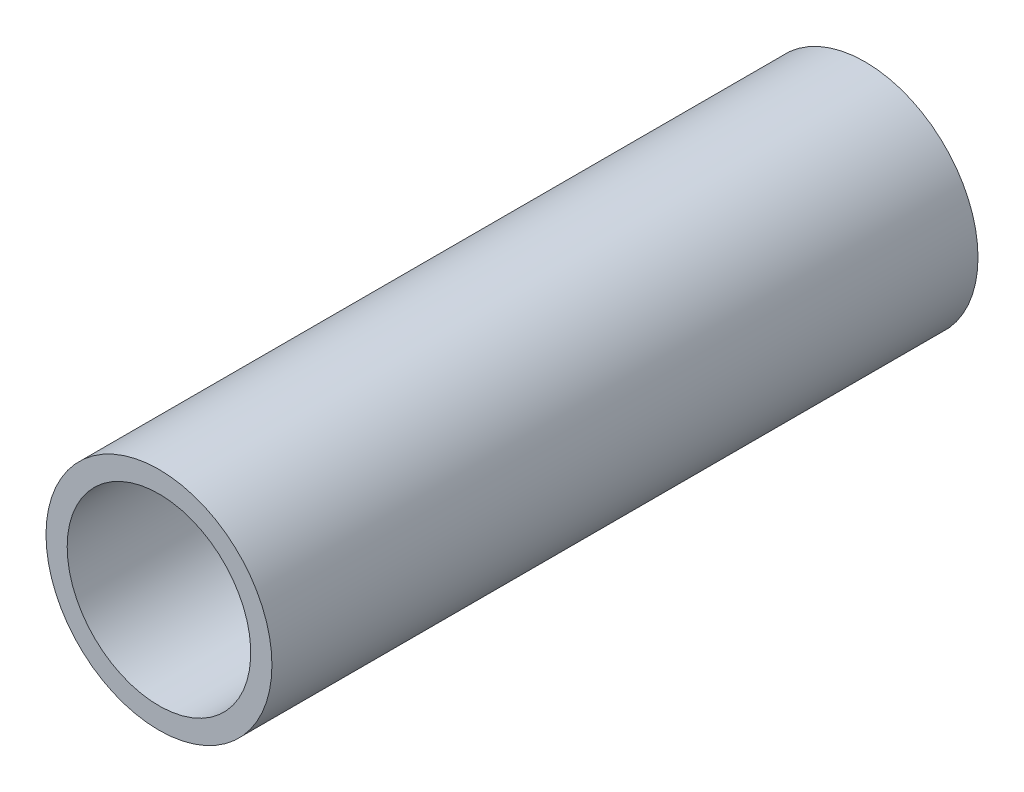
ISO-10303-21;
HEADER;
FILE_DESCRIPTION(('STEP AP214'),'2;1');
FILE_NAME('part.step','',(''),(''),'','','');
FILE_SCHEMA(('AUTOMOTIVE_DESIGN { 1 0 10303 214 1 1 1 1 }'));
ENDSEC;
DATA;
#1=APPLICATION_CONTEXT('core data for automotive mechanical design processes');
#2=APPLICATION_PROTOCOL_DEFINITION('international standard','automotive_design',2000,#1);
#3=PRODUCT_CONTEXT('',#1,'mechanical');
#4=PRODUCT('Part','Part','',(#3));
#5=PRODUCT_RELATED_PRODUCT_CATEGORY('part','',(#4));
#6=PRODUCT_DEFINITION_FORMATION('','',#4);
#7=PRODUCT_DEFINITION_CONTEXT('part definition',#1,'design');
#8=PRODUCT_DEFINITION('design','',#6,#7);
#9=PRODUCT_DEFINITION_SHAPE('','',#8);
#10=(LENGTH_UNIT() NAMED_UNIT(*) SI_UNIT(.MILLI.,.METRE.));
#11=(NAMED_UNIT(*) PLANE_ANGLE_UNIT() SI_UNIT($,.RADIAN.));
#12=(NAMED_UNIT(*) SI_UNIT($,.STERADIAN.) SOLID_ANGLE_UNIT());
#13=UNCERTAINTY_MEASURE_WITH_UNIT(LENGTH_MEASURE(1.E-05),#10,'distance_accuracy_value','');
#14=(GEOMETRIC_REPRESENTATION_CONTEXT(3) GLOBAL_UNCERTAINTY_ASSIGNED_CONTEXT((#13)) GLOBAL_UNIT_ASSIGNED_CONTEXT((#10,
#11,#12)) REPRESENTATION_CONTEXT('',''));
#15=CARTESIAN_POINT('',(0.,0.,0.));
#16=DIRECTION('',(0.,0.,1.));
#17=DIRECTION('',(1.,0.,0.));
#18=AXIS2_PLACEMENT_3D('',#15,#16,#17);
#19=CARTESIAN_POINT('',(0.,0.,50.));
#20=DIRECTION('',(0.,0.,-1.));
#21=DIRECTION('',(-1.,0.,0.));
#22=AXIS2_PLACEMENT_3D('',#19,#20,#21);
#23=CYLINDRICAL_SURFACE('',#22,16.);
#24=CARTESIAN_POINT('',(0.,0.,50.));
#25=DIRECTION('',(0.,0.,1.));
#26=DIRECTION('',(1.,0.,0.));
#27=AXIS2_PLACEMENT_3D('',#24,#25,#26);
#28=CIRCLE('',#27,16.);
#29=CARTESIAN_POINT('',(-16.,0.,50.));
#30=VERTEX_POINT('',#29);
#31=EDGE_CURVE('E10',#30,#30,#28,.T.);
#32=CARTESIAN_POINT('',(0.,0.,-50.));
#33=DIRECTION('',(0.,0.,1.));
#34=DIRECTION('',(1.,0.,0.));
#35=AXIS2_PLACEMENT_3D('',#32,#33,#34);
#36=CIRCLE('',#35,16.);
#37=CARTESIAN_POINT('',(-16.,0.,-50.));
#38=VERTEX_POINT('',#37);
#39=EDGE_CURVE('E36',#38,#38,#36,.T.);
#40=CARTESIAN_POINT('',(-16.,0.,50.));
#41=CARTESIAN_POINT('',(-16.,0.,48.9583333333333));
#42=CARTESIAN_POINT('',(-16.,0.,47.9166666666667));
#43=CARTESIAN_POINT('',(-16.,0.,45.8333333333333));
#44=CARTESIAN_POINT('',(-16.,0.,44.7916666666667));
#45=CARTESIAN_POINT('',(-16.,0.,42.7083333333333));
#46=CARTESIAN_POINT('',(-16.,0.,41.6666666666667));
#47=CARTESIAN_POINT('',(-16.,0.,39.5833333333333));
#48=CARTESIAN_POINT('',(-16.,0.,38.5416666666667));
#49=CARTESIAN_POINT('',(-16.,0.,36.4583333333333));
#50=CARTESIAN_POINT('',(-16.,0.,35.4166666666667));
#51=CARTESIAN_POINT('',(-16.,0.,33.3333333333333));
#52=CARTESIAN_POINT('',(-16.,0.,32.2916666666667));
#53=CARTESIAN_POINT('',(-16.,0.,30.2083333333333));
#54=CARTESIAN_POINT('',(-16.,0.,29.1666666666667));
#55=CARTESIAN_POINT('',(-16.,0.,27.0833333333333));
#56=CARTESIAN_POINT('',(-16.,0.,26.0416666666667));
#57=CARTESIAN_POINT('',(-16.,0.,23.9583333333333));
#58=CARTESIAN_POINT('',(-16.,0.,22.9166666666667));
#59=CARTESIAN_POINT('',(-16.,0.,20.8333333333333));
#60=CARTESIAN_POINT('',(-16.,0.,19.7916666666667));
#61=CARTESIAN_POINT('',(-16.,0.,17.7083333333333));
#62=CARTESIAN_POINT('',(-16.,0.,16.6666666666667));
#63=CARTESIAN_POINT('',(-16.,0.,14.5833333333333));
#64=CARTESIAN_POINT('',(-16.,0.,13.5416666666667));
#65=CARTESIAN_POINT('',(-16.,0.,11.4583333333333));
#66=CARTESIAN_POINT('',(-16.,0.,10.4166666666667));
#67=CARTESIAN_POINT('',(-16.,0.,8.33333333333333));
#68=CARTESIAN_POINT('',(-16.,0.,7.29166666666666));
#69=CARTESIAN_POINT('',(-16.,0.,5.20833333333333));
#70=CARTESIAN_POINT('',(-16.,0.,4.16666666666666));
#71=CARTESIAN_POINT('',(-16.,0.,2.08333333333333));
#72=CARTESIAN_POINT('',(-16.,0.,1.04166666666666));
#73=CARTESIAN_POINT('',(-16.,0.,-1.04166666666667));
#74=CARTESIAN_POINT('',(-16.,0.,-2.08333333333334));
#75=CARTESIAN_POINT('',(-16.,0.,-4.16666666666667));
#76=CARTESIAN_POINT('',(-16.,0.,-5.20833333333334));
#77=CARTESIAN_POINT('',(-16.,0.,-7.29166666666667));
#78=CARTESIAN_POINT('',(-16.,0.,-8.33333333333334));
#79=CARTESIAN_POINT('',(-16.,0.,-10.4166666666667));
#80=CARTESIAN_POINT('',(-16.,0.,-11.4583333333333));
#81=CARTESIAN_POINT('',(-16.,0.,-13.5416666666667));
#82=CARTESIAN_POINT('',(-16.,0.,-14.5833333333333));
#83=CARTESIAN_POINT('',(-16.,0.,-16.6666666666667));
#84=CARTESIAN_POINT('',(-16.,0.,-17.7083333333333));
#85=CARTESIAN_POINT('',(-16.,0.,-19.7916666666667));
#86=CARTESIAN_POINT('',(-16.,0.,-20.8333333333333));
#87=CARTESIAN_POINT('',(-16.,0.,-22.9166666666667));
#88=CARTESIAN_POINT('',(-16.,0.,-23.9583333333333));
#89=CARTESIAN_POINT('',(-16.,0.,-26.0416666666667));
#90=CARTESIAN_POINT('',(-16.,0.,-27.0833333333333));
#91=CARTESIAN_POINT('',(-16.,0.,-29.1666666666667));
#92=CARTESIAN_POINT('',(-16.,0.,-30.2083333333333));
#93=CARTESIAN_POINT('',(-16.,0.,-32.2916666666667));
#94=CARTESIAN_POINT('',(-16.,0.,-33.3333333333333));
#95=CARTESIAN_POINT('',(-16.,0.,-35.4166666666667));
#96=CARTESIAN_POINT('',(-16.,0.,-36.4583333333333));
#97=CARTESIAN_POINT('',(-16.,0.,-38.5416666666667));
#98=CARTESIAN_POINT('',(-16.,0.,-39.5833333333333));
#99=CARTESIAN_POINT('',(-16.,0.,-41.6666666666667));
#100=CARTESIAN_POINT('',(-16.,0.,-42.7083333333333));
#101=CARTESIAN_POINT('',(-16.,0.,-44.7916666666667));
#102=CARTESIAN_POINT('',(-16.,0.,-45.8333333333333));
#103=CARTESIAN_POINT('',(-16.,0.,-47.9166666666667));
#104=CARTESIAN_POINT('',(-16.,0.,-48.9583333333333));
#105=CARTESIAN_POINT('',(-16.,0.,-50.));
#106=B_SPLINE_CURVE_WITH_KNOTS('',3,(#40,#41,#42,#43,#44,#45,#46,#47,#48,#49,#50,#51,#52,#53,
#54,#55,#56,#57,#58,#59,#60,#61,#62,#63,#64,#65,#66,#67,#68,#69,#70,#71,#72,#73,#74,#75,#76,#77,
#78,#79,#80,#81,#82,#83,#84,#85,#86,#87,#88,#89,#90,#91,#92,#93,#94,#95,#96,#97,#98,#99,#100,
#101,#102,#103,#104,#105),.UNSPECIFIED.,.F.,.F.,(4,2,2,2,2,2,2,2,2,2,2,2,2,2,2,2,2,2,2,2,2,2,2,
2,2,2,2,2,2,2,2,2,4),(0.,3.125,6.25,9.37499999999999,12.5,15.625,18.75,21.875,25.,28.125,31.25,
34.375,37.5,40.625,43.75,46.875,50.,53.125,56.25,59.375,62.5,65.625,68.75,71.875,75.,78.125,
81.25,84.375,87.5,90.625,93.75,96.875,100.),.UNSPECIFIED.);
#107=EDGE_CURVE('BSEAM33',#30,#38,#106,.T.);
#108=ORIENTED_EDGE('',*,*,#31,.F.);
#109=ORIENTED_EDGE('',*,*,#39,.T.);
#110=ORIENTED_EDGE('',*,*,#107,.T.);
#111=ORIENTED_EDGE('',*,*,#107,.F.);
#112=EDGE_LOOP('',(#108,#110,#109,#111));
#113=FACE_BOUND('',#112,.T.);
#114=ADVANCED_FACE('F33',(#113),#23,.T.);
#115=CARTESIAN_POINT('',(0.,0.,50.));
#116=DIRECTION('',(0.,0.,1.));
#117=DIRECTION('',(1.,0.,0.));
#118=AXIS2_PLACEMENT_3D('',#115,#116,#117);
#119=PLANE('',#118);
#120=CARTESIAN_POINT('',(0.,0.,50.));
#121=DIRECTION('',(0.,0.,1.));
#122=DIRECTION('',(1.,0.,0.));
#123=AXIS2_PLACEMENT_3D('',#120,#121,#122);
#124=CIRCLE('',#123,13.);
#125=CARTESIAN_POINT('',(-13.,0.,50.));
#126=VERTEX_POINT('',#125);
#127=EDGE_CURVE('E43',#126,#126,#124,.T.);
#128=ORIENTED_EDGE('',*,*,#127,.F.);
#129=EDGE_LOOP('',(#128));
#130=FACE_BOUND('',#129,.T.);
#131=ORIENTED_EDGE('',*,*,#31,.T.);
#132=EDGE_LOOP('',(#131));
#133=FACE_BOUND('',#132,.T.);
#134=ADVANCED_FACE('F54',(#130,#133),#119,.T.);
#135=CARTESIAN_POINT('',(0.,0.,-50.));
#136=DIRECTION('',(0.,0.,1.));
#137=DIRECTION('',(1.,0.,0.));
#138=AXIS2_PLACEMENT_3D('',#135,#136,#137);
#139=PLANE('',#138);
#140=CARTESIAN_POINT('',(0.,0.,-50.));
#141=DIRECTION('',(0.,0.,1.));
#142=DIRECTION('',(1.,0.,0.));
#143=AXIS2_PLACEMENT_3D('',#140,#141,#142);
#144=CIRCLE('',#143,13.);
#145=CARTESIAN_POINT('',(-13.,0.,-50.));
#146=VERTEX_POINT('',#145);
#147=EDGE_CURVE('E45',#146,#146,#144,.T.);
#148=ORIENTED_EDGE('',*,*,#147,.T.);
#149=EDGE_LOOP('',(#148));
#150=FACE_BOUND('',#149,.T.);
#151=ORIENTED_EDGE('',*,*,#39,.F.);
#152=EDGE_LOOP('',(#151));
#153=FACE_BOUND('',#152,.T.);
#154=ADVANCED_FACE('F56',(#150,#153),#139,.F.);
#155=CARTESIAN_POINT('',(0.,0.,50.));
#156=DIRECTION('',(0.,0.,-1.));
#157=DIRECTION('',(-1.,0.,0.));
#158=AXIS2_PLACEMENT_3D('',#155,#156,#157);
#159=CYLINDRICAL_SURFACE('',#158,13.);
#160=CARTESIAN_POINT('',(-13.,0.,50.));
#161=CARTESIAN_POINT('',(-13.,0.,48.9583333333333));
#162=CARTESIAN_POINT('',(-13.,0.,47.9166666666667));
#163=CARTESIAN_POINT('',(-13.,0.,45.8333333333333));
#164=CARTESIAN_POINT('',(-13.,0.,44.7916666666667));
#165=CARTESIAN_POINT('',(-13.,0.,42.7083333333333));
#166=CARTESIAN_POINT('',(-13.,0.,41.6666666666667));
#167=CARTESIAN_POINT('',(-13.,0.,39.5833333333333));
#168=CARTESIAN_POINT('',(-13.,0.,38.5416666666667));
#169=CARTESIAN_POINT('',(-13.,0.,36.4583333333333));
#170=CARTESIAN_POINT('',(-13.,0.,35.4166666666667));
#171=CARTESIAN_POINT('',(-13.,0.,33.3333333333333));
#172=CARTESIAN_POINT('',(-13.,0.,32.2916666666667));
#173=CARTESIAN_POINT('',(-13.,0.,30.2083333333333));
#174=CARTESIAN_POINT('',(-13.,0.,29.1666666666667));
#175=CARTESIAN_POINT('',(-13.,0.,27.0833333333333));
#176=CARTESIAN_POINT('',(-13.,0.,26.0416666666667));
#177=CARTESIAN_POINT('',(-13.,0.,23.9583333333333));
#178=CARTESIAN_POINT('',(-13.,0.,22.9166666666667));
#179=CARTESIAN_POINT('',(-13.,0.,20.8333333333333));
#180=CARTESIAN_POINT('',(-13.,0.,19.7916666666667));
#181=CARTESIAN_POINT('',(-13.,0.,17.7083333333333));
#182=CARTESIAN_POINT('',(-13.,0.,16.6666666666667));
#183=CARTESIAN_POINT('',(-13.,0.,14.5833333333333));
#184=CARTESIAN_POINT('',(-13.,0.,13.5416666666667));
#185=CARTESIAN_POINT('',(-13.,0.,11.4583333333333));
#186=CARTESIAN_POINT('',(-13.,0.,10.4166666666667));
#187=CARTESIAN_POINT('',(-13.,0.,8.33333333333333));
#188=CARTESIAN_POINT('',(-13.,0.,7.29166666666666));
#189=CARTESIAN_POINT('',(-13.,0.,5.20833333333333));
#190=CARTESIAN_POINT('',(-13.,0.,4.16666666666666));
#191=CARTESIAN_POINT('',(-13.,0.,2.08333333333333));
#192=CARTESIAN_POINT('',(-13.,0.,1.04166666666666));
#193=CARTESIAN_POINT('',(-13.,0.,-1.04166666666667));
#194=CARTESIAN_POINT('',(-13.,0.,-2.08333333333334));
#195=CARTESIAN_POINT('',(-13.,0.,-4.16666666666667));
#196=CARTESIAN_POINT('',(-13.,0.,-5.20833333333334));
#197=CARTESIAN_POINT('',(-13.,0.,-7.29166666666667));
#198=CARTESIAN_POINT('',(-13.,0.,-8.33333333333334));
#199=CARTESIAN_POINT('',(-13.,0.,-10.4166666666667));
#200=CARTESIAN_POINT('',(-13.,0.,-11.4583333333333));
#201=CARTESIAN_POINT('',(-13.,0.,-13.5416666666667));
#202=CARTESIAN_POINT('',(-13.,0.,-14.5833333333333));
#203=CARTESIAN_POINT('',(-13.,0.,-16.6666666666667));
#204=CARTESIAN_POINT('',(-13.,0.,-17.7083333333333));
#205=CARTESIAN_POINT('',(-13.,0.,-19.7916666666667));
#206=CARTESIAN_POINT('',(-13.,0.,-20.8333333333333));
#207=CARTESIAN_POINT('',(-13.,0.,-22.9166666666667));
#208=CARTESIAN_POINT('',(-13.,0.,-23.9583333333333));
#209=CARTESIAN_POINT('',(-13.,0.,-26.0416666666667));
#210=CARTESIAN_POINT('',(-13.,0.,-27.0833333333333));
#211=CARTESIAN_POINT('',(-13.,0.,-29.1666666666667));
#212=CARTESIAN_POINT('',(-13.,0.,-30.2083333333333));
#213=CARTESIAN_POINT('',(-13.,0.,-32.2916666666667));
#214=CARTESIAN_POINT('',(-13.,0.,-33.3333333333333));
#215=CARTESIAN_POINT('',(-13.,0.,-35.4166666666667));
#216=CARTESIAN_POINT('',(-13.,0.,-36.4583333333333));
#217=CARTESIAN_POINT('',(-13.,0.,-38.5416666666667));
#218=CARTESIAN_POINT('',(-13.,0.,-39.5833333333333));
#219=CARTESIAN_POINT('',(-13.,0.,-41.6666666666667));
#220=CARTESIAN_POINT('',(-13.,0.,-42.7083333333333));
#221=CARTESIAN_POINT('',(-13.,0.,-44.7916666666667));
#222=CARTESIAN_POINT('',(-13.,0.,-45.8333333333333));
#223=CARTESIAN_POINT('',(-13.,0.,-47.9166666666667));
#224=CARTESIAN_POINT('',(-13.,0.,-48.9583333333333));
#225=CARTESIAN_POINT('',(-13.,0.,-50.));
#226=B_SPLINE_CURVE_WITH_KNOTS('',3,(#160,#161,#162,#163,#164,#165,#166,#167,#168,#169,#170,
#171,#172,#173,#174,#175,#176,#177,#178,#179,#180,#181,#182,#183,#184,#185,#186,#187,#188,#189,
#190,#191,#192,#193,#194,#195,#196,#197,#198,#199,#200,#201,#202,#203,#204,#205,#206,#207,#208,
#209,#210,#211,#212,#213,#214,#215,#216,#217,#218,#219,#220,#221,#222,#223,#224,#225),
.UNSPECIFIED.,.F.,.F.,(4,2,2,2,2,2,2,2,2,2,2,2,2,2,2,2,2,2,2,2,2,2,2,2,2,2,2,2,2,2,2,2,4),(0.,
3.125,6.25,9.37499999999999,12.5,15.625,18.75,21.875,25.,28.125,31.25,34.375,37.5,40.625,43.75,
46.875,50.,53.125,56.25,59.375,62.5,65.625,68.75,71.875,75.,78.125,81.25,84.375,87.5,90.625,
93.75,96.875,100.),.UNSPECIFIED.);
#227=EDGE_CURVE('BSEAM51',#126,#146,#226,.T.);
#228=ORIENTED_EDGE('',*,*,#127,.T.);
#229=ORIENTED_EDGE('',*,*,#147,.F.);
#230=ORIENTED_EDGE('',*,*,#227,.T.);
#231=ORIENTED_EDGE('',*,*,#227,.F.);
#232=EDGE_LOOP('',(#228,#230,#229,#231));
#233=FACE_BOUND('',#232,.T.);
#234=ADVANCED_FACE('F51',(#233),#159,.F.);
#235=CLOSED_SHELL('',(#114,#134,#154,#234));
#236=MANIFOLD_SOLID_BREP('B2',#235);
#237=ADVANCED_BREP_SHAPE_REPRESENTATION('',(#18,#236),#14);
#238=SHAPE_DEFINITION_REPRESENTATION(#9,#237);
ENDSEC;
END-ISO-10303-21;
